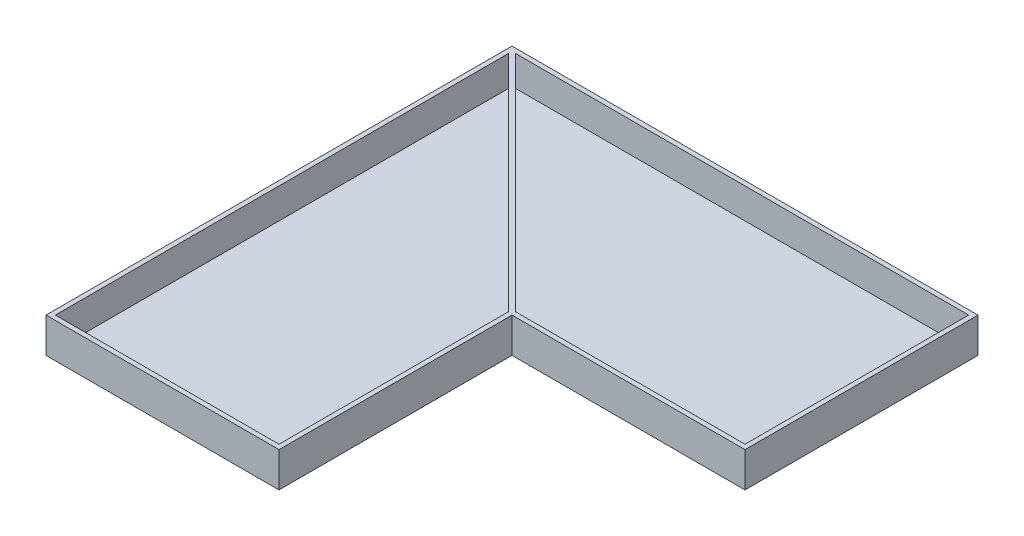
ISO-10303-21;
HEADER;
FILE_DESCRIPTION(('STEP AP214'),'2;1');
FILE_NAME('part.step','',(''),(''),'','','');
FILE_SCHEMA(('AUTOMOTIVE_DESIGN { 1 0 10303 214 1 1 1 1 }'));
ENDSEC;
DATA;
#1=APPLICATION_CONTEXT('core data for automotive mechanical design processes');
#2=APPLICATION_PROTOCOL_DEFINITION('international standard','automotive_design',2000,#1);
#3=PRODUCT_CONTEXT('',#1,'mechanical');
#4=PRODUCT('Part','Part','',(#3));
#5=PRODUCT_RELATED_PRODUCT_CATEGORY('part','',(#4));
#6=PRODUCT_DEFINITION_FORMATION('','',#4);
#7=PRODUCT_DEFINITION_CONTEXT('part definition',#1,'design');
#8=PRODUCT_DEFINITION('design','',#6,#7);
#9=PRODUCT_DEFINITION_SHAPE('','',#8);
#10=(LENGTH_UNIT() NAMED_UNIT(*) SI_UNIT(.MILLI.,.METRE.));
#11=(NAMED_UNIT(*) PLANE_ANGLE_UNIT() SI_UNIT($,.RADIAN.));
#12=(NAMED_UNIT(*) SI_UNIT($,.STERADIAN.) SOLID_ANGLE_UNIT());
#13=UNCERTAINTY_MEASURE_WITH_UNIT(LENGTH_MEASURE(1.E-05),#10,'distance_accuracy_value','');
#14=(GEOMETRIC_REPRESENTATION_CONTEXT(3) GLOBAL_UNCERTAINTY_ASSIGNED_CONTEXT((#13)) GLOBAL_UNIT_ASSIGNED_CONTEXT((#10,
#11,#12)) REPRESENTATION_CONTEXT('',''));
#15=CARTESIAN_POINT('',(0.,0.,0.));
#16=DIRECTION('',(0.,0.,1.));
#17=DIRECTION('',(1.,0.,0.));
#18=AXIS2_PLACEMENT_3D('',#15,#16,#17);
#19=CARTESIAN_POINT('',(0.,20.,0.));
#20=DIRECTION('',(0.,0.,1.));
#21=DIRECTION('',(1.,0.,0.));
#22=AXIS2_PLACEMENT_3D('',#19,#20,#21);
#23=PLANE('',#22);
#24=DIRECTION('',(-1.,0.,0.));
#25=VECTOR('',#24,1.);
#26=CARTESIAN_POINT('',(0.,0.,0.));
#27=LINE('',#26,#25);
#28=CARTESIAN_POINT('',(2000.,0.,0.));
#29=VERTEX_POINT('',#28);
#30=CARTESIAN_POINT('',(0.,0.,0.));
#31=VERTEX_POINT('',#30);
#32=EDGE_CURVE('E264',#29,#31,#27,.T.);
#33=ORIENTED_EDGE('',*,*,#32,.T.);
#34=DIRECTION('',(0.,-1.,0.));
#35=VECTOR('',#34,1.);
#36=CARTESIAN_POINT('',(0.,20.,0.));
#37=LINE('',#36,#35);
#38=CARTESIAN_POINT('',(0.,150.,0.));
#39=VERTEX_POINT('',#38);
#40=EDGE_CURVE('E11',#39,#31,#37,.T.);
#41=ORIENTED_EDGE('',*,*,#40,.F.);
#42=DIRECTION('',(-1.,0.,0.));
#43=VECTOR('',#42,1.);
#44=CARTESIAN_POINT('',(2000.,150.,0.));
#45=LINE('',#44,#43);
#46=CARTESIAN_POINT('',(2000.,150.,0.));
#47=VERTEX_POINT('',#46);
#48=EDGE_CURVE('E260',#47,#39,#45,.T.);
#49=ORIENTED_EDGE('',*,*,#48,.F.);
#50=DIRECTION('',(0.,-1.,0.));
#51=VECTOR('',#50,1.);
#52=CARTESIAN_POINT('',(2000.,20.,0.));
#53=LINE('',#52,#51);
#54=EDGE_CURVE('E283',#47,#29,#53,.T.);
#55=ORIENTED_EDGE('',*,*,#54,.T.);
#56=EDGE_LOOP('',(#33,#41,#49,#55));
#57=FACE_BOUND('',#56,.T.);
#58=ADVANCED_FACE('F45',(#57),#23,.F.);
#59=CARTESIAN_POINT('',(0.,20.,0.));
#60=DIRECTION('',(1.,0.,0.));
#61=DIRECTION('',(0.,0.,-1.));
#62=AXIS2_PLACEMENT_3D('',#59,#60,#61);
#63=PLANE('',#62);
#64=DIRECTION('',(0.,0.,1.));
#65=VECTOR('',#64,1.);
#66=CARTESIAN_POINT('',(0.,0.,0.));
#67=LINE('',#66,#65);
#68=CARTESIAN_POINT('',(2.44929359829471E-13,0.,2000.));
#69=VERTEX_POINT('',#68);
#70=EDGE_CURVE('E268',#31,#69,#67,.T.);
#71=ORIENTED_EDGE('',*,*,#70,.T.);
#72=DIRECTION('',(0.,-1.,0.));
#73=VECTOR('',#72,1.);
#74=CARTESIAN_POINT('',(2.44929359829471E-13,20.,2000.));
#75=LINE('',#74,#73);
#76=CARTESIAN_POINT('',(2.44929359829471E-13,150.,2000.));
#77=VERTEX_POINT('',#76);
#78=EDGE_CURVE('E53',#77,#69,#75,.T.);
#79=ORIENTED_EDGE('',*,*,#78,.F.);
#80=DIRECTION('',(0.,0.,1.));
#81=VECTOR('',#80,1.);
#82=CARTESIAN_POINT('',(0.,150.,0.));
#83=LINE('',#82,#81);
#84=EDGE_CURVE('E240',#39,#77,#83,.T.);
#85=ORIENTED_EDGE('',*,*,#84,.F.);
#86=ORIENTED_EDGE('',*,*,#40,.T.);
#87=EDGE_LOOP('',(#71,#79,#85,#86));
#88=FACE_BOUND('',#87,.T.);
#89=ADVANCED_FACE('F325',(#88),#63,.F.);
#90=CARTESIAN_POINT('',(2.44929359829471E-13,20.,2000.));
#91=DIRECTION('',(0.,0.,-1.));
#92=DIRECTION('',(-1.,0.,0.));
#93=AXIS2_PLACEMENT_3D('',#90,#91,#92);
#94=PLANE('',#93);
#95=DIRECTION('',(1.,0.,0.));
#96=VECTOR('',#95,1.);
#97=CARTESIAN_POINT('',(2.44929359829471E-13,0.,2000.));
#98=LINE('',#97,#96);
#99=CARTESIAN_POINT('',(1000.,0.,2000.));
#100=VERTEX_POINT('',#99);
#101=EDGE_CURVE('E271',#69,#100,#98,.T.);
#102=ORIENTED_EDGE('',*,*,#101,.T.);
#103=DIRECTION('',(0.,-1.,0.));
#104=VECTOR('',#103,1.);
#105=CARTESIAN_POINT('',(1000.,20.,2000.));
#106=LINE('',#105,#104);
#107=CARTESIAN_POINT('',(1000.,150.,2000.));
#108=VERTEX_POINT('',#107);
#109=EDGE_CURVE('E295',#108,#100,#106,.T.);
#110=ORIENTED_EDGE('',*,*,#109,.F.);
#111=DIRECTION('',(1.,0.,0.));
#112=VECTOR('',#111,1.);
#113=CARTESIAN_POINT('',(2.44929359829471E-13,150.,2000.));
#114=LINE('',#113,#112);
#115=EDGE_CURVE('E244',#77,#108,#114,.T.);
#116=ORIENTED_EDGE('',*,*,#115,.F.);
#117=ORIENTED_EDGE('',*,*,#78,.T.);
#118=EDGE_LOOP('',(#102,#110,#116,#117));
#119=FACE_BOUND('',#118,.T.);
#120=ADVANCED_FACE('F303',(#119),#94,.F.);
#121=CARTESIAN_POINT('',(1000.,20.,1000.));
#122=DIRECTION('',(-1.,0.,0.));
#123=DIRECTION('',(0.,0.,1.));
#124=AXIS2_PLACEMENT_3D('',#121,#122,#123);
#125=PLANE('',#124);
#126=DIRECTION('',(0.,0.,-1.));
#127=VECTOR('',#126,1.);
#128=CARTESIAN_POINT('',(1000.,0.,1000.));
#129=LINE('',#128,#127);
#130=CARTESIAN_POINT('',(1000.,0.,1000.));
#131=VERTEX_POINT('',#130);
#132=EDGE_CURVE('E274',#100,#131,#129,.T.);
#133=ORIENTED_EDGE('',*,*,#132,.T.);
#134=DIRECTION('',(0.,-1.,0.));
#135=VECTOR('',#134,1.);
#136=CARTESIAN_POINT('',(1000.,20.,1000.));
#137=LINE('',#136,#135);
#138=CARTESIAN_POINT('',(1000.,150.,1000.));
#139=VERTEX_POINT('',#138);
#140=EDGE_CURVE('E291',#139,#131,#137,.T.);
#141=ORIENTED_EDGE('',*,*,#140,.F.);
#142=DIRECTION('',(0.,0.,-1.));
#143=VECTOR('',#142,1.);
#144=CARTESIAN_POINT('',(1000.,150.,2000.));
#145=LINE('',#144,#143);
#146=EDGE_CURVE('E248',#108,#139,#145,.T.);
#147=ORIENTED_EDGE('',*,*,#146,.F.);
#148=ORIENTED_EDGE('',*,*,#109,.T.);
#149=EDGE_LOOP('',(#133,#141,#147,#148));
#150=FACE_BOUND('',#149,.T.);
#151=ADVANCED_FACE('F313',(#150),#125,.F.);
#152=CARTESIAN_POINT('',(1000.,20.,1000.));
#153=DIRECTION('',(0.,0.,-1.));
#154=DIRECTION('',(-1.,0.,0.));
#155=AXIS2_PLACEMENT_3D('',#152,#153,#154);
#156=PLANE('',#155);
#157=DIRECTION('',(1.,0.,0.));
#158=VECTOR('',#157,1.);
#159=CARTESIAN_POINT('',(1000.,0.,1000.));
#160=LINE('',#159,#158);
#161=CARTESIAN_POINT('',(2000.,0.,1000.));
#162=VERTEX_POINT('',#161);
#163=EDGE_CURVE('E277',#131,#162,#160,.T.);
#164=ORIENTED_EDGE('',*,*,#163,.T.);
#165=DIRECTION('',(0.,-1.,0.));
#166=VECTOR('',#165,1.);
#167=CARTESIAN_POINT('',(2000.,20.,1000.));
#168=LINE('',#167,#166);
#169=CARTESIAN_POINT('',(2000.,150.,1000.));
#170=VERTEX_POINT('',#169);
#171=EDGE_CURVE('E287',#170,#162,#168,.T.);
#172=ORIENTED_EDGE('',*,*,#171,.F.);
#173=DIRECTION('',(1.,0.,0.));
#174=VECTOR('',#173,1.);
#175=CARTESIAN_POINT('',(1000.,150.,1000.));
#176=LINE('',#175,#174);
#177=EDGE_CURVE('E252',#139,#170,#176,.T.);
#178=ORIENTED_EDGE('',*,*,#177,.F.);
#179=ORIENTED_EDGE('',*,*,#140,.T.);
#180=EDGE_LOOP('',(#164,#172,#178,#179));
#181=FACE_BOUND('',#180,.T.);
#182=ADVANCED_FACE('F317',(#181),#156,.F.);
#183=CARTESIAN_POINT('',(2000.,20.,0.));
#184=DIRECTION('',(-1.,0.,0.));
#185=DIRECTION('',(0.,0.,1.));
#186=AXIS2_PLACEMENT_3D('',#183,#184,#185);
#187=PLANE('',#186);
#188=DIRECTION('',(0.,0.,-1.));
#189=VECTOR('',#188,1.);
#190=CARTESIAN_POINT('',(2000.,0.,0.));
#191=LINE('',#190,#189);
#192=EDGE_CURVE('E280',#162,#29,#191,.T.);
#193=ORIENTED_EDGE('',*,*,#192,.T.);
#194=ORIENTED_EDGE('',*,*,#54,.F.);
#195=DIRECTION('',(0.,0.,-1.));
#196=VECTOR('',#195,1.);
#197=CARTESIAN_POINT('',(2000.,150.,1000.));
#198=LINE('',#197,#196);
#199=EDGE_CURVE('E256',#170,#47,#198,.T.);
#200=ORIENTED_EDGE('',*,*,#199,.F.);
#201=ORIENTED_EDGE('',*,*,#171,.T.);
#202=EDGE_LOOP('',(#193,#194,#200,#201));
#203=FACE_BOUND('',#202,.T.);
#204=ADVANCED_FACE('F323',(#203),#187,.F.);
#205=CARTESIAN_POINT('',(0.,0.,0.));
#206=DIRECTION('',(0.,-1.,0.));
#207=DIRECTION('',(0.,0.,-1.));
#208=AXIS2_PLACEMENT_3D('',#205,#206,#207);
#209=PLANE('',#208);
#210=ORIENTED_EDGE('',*,*,#32,.F.);
#211=ORIENTED_EDGE('',*,*,#192,.F.);
#212=ORIENTED_EDGE('',*,*,#163,.F.);
#213=ORIENTED_EDGE('',*,*,#132,.F.);
#214=ORIENTED_EDGE('',*,*,#101,.F.);
#215=ORIENTED_EDGE('',*,*,#70,.F.);
#216=EDGE_LOOP('',(#210,#211,#212,#213,#214,#215));
#217=FACE_BOUND('',#216,.T.);
#218=ADVANCED_FACE('F309',(#217),#209,.T.);
#219=CARTESIAN_POINT('',(0.,150.,0.));
#220=DIRECTION('',(0.,1.,0.));
#221=DIRECTION('',(0.,0.,1.));
#222=AXIS2_PLACEMENT_3D('',#219,#220,#221);
#223=PLANE('',#222);
#224=ORIENTED_EDGE('',*,*,#84,.T.);
#225=ORIENTED_EDGE('',*,*,#115,.T.);
#226=ORIENTED_EDGE('',*,*,#146,.T.);
#227=ORIENTED_EDGE('',*,*,#177,.T.);
#228=ORIENTED_EDGE('',*,*,#199,.T.);
#229=ORIENTED_EDGE('',*,*,#48,.T.);
#230=EDGE_LOOP('',(#224,#225,#226,#227,#228,#229));
#231=FACE_BOUND('',#230,.T.);
#232=DIRECTION('',(0.,0.,-1.));
#233=VECTOR('',#232,1.);
#234=CARTESIAN_POINT('',(980.,150.,1980.));
#235=LINE('',#234,#233);
#236=CARTESIAN_POINT('',(980.,150.,1980.));
#237=VERTEX_POINT('',#236);
#238=CARTESIAN_POINT('',(980.,150.,994.142135623732));
#239=VERTEX_POINT('',#238);
#240=EDGE_CURVE('E203',#237,#239,#235,.T.);
#241=ORIENTED_EDGE('',*,*,#240,.F.);
#242=DIRECTION('',(1.,0.,0.));
#243=VECTOR('',#242,1.);
#244=CARTESIAN_POINT('',(20.,150.,1980.));
#245=LINE('',#244,#243);
#246=CARTESIAN_POINT('',(20.,150.,1980.));
#247=VERTEX_POINT('',#246);
#248=EDGE_CURVE('E200',#247,#237,#245,.T.);
#249=ORIENTED_EDGE('',*,*,#248,.F.);
#250=DIRECTION('',(0.,0.,1.));
#251=VECTOR('',#250,1.);
#252=CARTESIAN_POINT('',(20.,150.,34.142135623731));
#253=LINE('',#252,#251);
#254=CARTESIAN_POINT('',(20.,150.,34.142135623731));
#255=VERTEX_POINT('',#254);
#256=EDGE_CURVE('E211',#255,#247,#253,.T.);
#257=ORIENTED_EDGE('',*,*,#256,.F.);
#258=DIRECTION('',(-0.707106781186547,0.,-0.707106781186548));
#259=VECTOR('',#258,1.);
#260=CARTESIAN_POINT('',(20.,150.,34.142135623731));
#261=LINE('',#260,#259);
#262=EDGE_CURVE('E207',#239,#255,#261,.T.);
#263=ORIENTED_EDGE('',*,*,#262,.F.);
#264=EDGE_LOOP('',(#241,#249,#257,#263));
#265=FACE_BOUND('',#264,.T.);
#266=DIRECTION('',(-1.,0.,0.));
#267=VECTOR('',#266,1.);
#268=CARTESIAN_POINT('',(1980.,150.,20.));
#269=LINE('',#268,#267);
#270=CARTESIAN_POINT('',(1980.,150.,20.));
#271=VERTEX_POINT('',#270);
#272=CARTESIAN_POINT('',(34.1421356237314,150.,20.0000000000001));
#273=VERTEX_POINT('',#272);
#274=EDGE_CURVE('E157',#271,#273,#269,.T.);
#275=ORIENTED_EDGE('',*,*,#274,.F.);
#276=DIRECTION('',(0.,0.,-1.));
#277=VECTOR('',#276,1.);
#278=CARTESIAN_POINT('',(1980.,150.,980.));
#279=LINE('',#278,#277);
#280=CARTESIAN_POINT('',(1980.,150.,980.));
#281=VERTEX_POINT('',#280);
#282=EDGE_CURVE('E148',#281,#271,#279,.T.);
#283=ORIENTED_EDGE('',*,*,#282,.F.);
#284=DIRECTION('',(1.,0.,0.));
#285=VECTOR('',#284,1.);
#286=CARTESIAN_POINT('',(994.142135623731,150.,980.));
#287=LINE('',#286,#285);
#288=CARTESIAN_POINT('',(994.142135623731,150.,980.));
#289=VERTEX_POINT('',#288);
#290=EDGE_CURVE('E176',#289,#281,#287,.T.);
#291=ORIENTED_EDGE('',*,*,#290,.F.);
#292=DIRECTION('',(0.707106781186547,0.,0.707106781186548));
#293=VECTOR('',#292,1.);
#294=CARTESIAN_POINT('',(34.1421356237314,150.,20.0000000000001));
#295=LINE('',#294,#293);
#296=EDGE_CURVE('E172',#273,#289,#295,.T.);
#297=ORIENTED_EDGE('',*,*,#296,.F.);
#298=EDGE_LOOP('',(#275,#283,#291,#297));
#299=FACE_BOUND('',#298,.T.);
#300=ADVANCED_FACE('F170',(#231,#265,#299),#223,.T.);
#301=CARTESIAN_POINT('',(20.,150.,1980.));
#302=DIRECTION('',(0.,0.,-1.));
#303=DIRECTION('',(-1.,0.,0.));
#304=AXIS2_PLACEMENT_3D('',#301,#302,#303);
#305=PLANE('',#304);
#306=DIRECTION('',(1.,0.,0.));
#307=VECTOR('',#306,1.);
#308=CARTESIAN_POINT('',(20.,20.,1980.));
#309=LINE('',#308,#307);
#310=CARTESIAN_POINT('',(20.,20.,1980.));
#311=VERTEX_POINT('',#310);
#312=CARTESIAN_POINT('',(980.,20.,1980.));
#313=VERTEX_POINT('',#312);
#314=EDGE_CURVE('E166',#311,#313,#309,.T.);
#315=ORIENTED_EDGE('',*,*,#314,.F.);
#316=DIRECTION('',(0.,-1.,0.));
#317=VECTOR('',#316,1.);
#318=CARTESIAN_POINT('',(20.,150.,1980.));
#319=LINE('',#318,#317);
#320=EDGE_CURVE('E60',#247,#311,#319,.T.);
#321=ORIENTED_EDGE('',*,*,#320,.F.);
#322=ORIENTED_EDGE('',*,*,#248,.T.);
#323=DIRECTION('',(0.,-1.,0.));
#324=VECTOR('',#323,1.);
#325=CARTESIAN_POINT('',(980.,150.,1980.));
#326=LINE('',#325,#324);
#327=EDGE_CURVE('E236',#237,#313,#326,.T.);
#328=ORIENTED_EDGE('',*,*,#327,.T.);
#329=EDGE_LOOP('',(#315,#321,#322,#328));
#330=FACE_BOUND('',#329,.T.);
#331=ADVANCED_FACE('F348',(#330),#305,.T.);
#332=CARTESIAN_POINT('',(980.,150.,1980.));
#333=DIRECTION('',(-1.,0.,0.));
#334=DIRECTION('',(0.,0.,1.));
#335=AXIS2_PLACEMENT_3D('',#332,#333,#334);
#336=PLANE('',#335);
#337=DIRECTION('',(0.,0.,-1.));
#338=VECTOR('',#337,1.);
#339=CARTESIAN_POINT('',(980.,20.,1980.));
#340=LINE('',#339,#338);
#341=CARTESIAN_POINT('',(980.,20.,994.142135623732));
#342=VERTEX_POINT('',#341);
#343=EDGE_CURVE('E217',#313,#342,#340,.T.);
#344=ORIENTED_EDGE('',*,*,#343,.F.);
#345=ORIENTED_EDGE('',*,*,#327,.F.);
#346=ORIENTED_EDGE('',*,*,#240,.T.);
#347=DIRECTION('',(0.,-1.,0.));
#348=VECTOR('',#347,1.);
#349=CARTESIAN_POINT('',(980.,150.,994.142135623732));
#350=LINE('',#349,#348);
#351=EDGE_CURVE('E233',#239,#342,#350,.T.);
#352=ORIENTED_EDGE('',*,*,#351,.T.);
#353=EDGE_LOOP('',(#344,#345,#346,#352));
#354=FACE_BOUND('',#353,.T.);
#355=ADVANCED_FACE('F351',(#354),#336,.T.);
#356=CARTESIAN_POINT('',(20.,150.,34.142135623731));
#357=DIRECTION('',(-0.707106781186548,0.,0.707106781186547));
#358=DIRECTION('',(0.707106781186547,0.,0.707106781186548));
#359=AXIS2_PLACEMENT_3D('',#356,#357,#358);
#360=PLANE('',#359);
#361=DIRECTION('',(-0.707106781186547,0.,-0.707106781186548));
#362=VECTOR('',#361,1.);
#363=CARTESIAN_POINT('',(20.,20.,34.142135623731));
#364=LINE('',#363,#362);
#365=CARTESIAN_POINT('',(20.,20.,34.142135623731));
#366=VERTEX_POINT('',#365);
#367=EDGE_CURVE('E221',#342,#366,#364,.T.);
#368=ORIENTED_EDGE('',*,*,#367,.F.);
#369=ORIENTED_EDGE('',*,*,#351,.F.);
#370=ORIENTED_EDGE('',*,*,#262,.T.);
#371=DIRECTION('',(0.,-1.,0.));
#372=VECTOR('',#371,1.);
#373=CARTESIAN_POINT('',(20.,150.,34.142135623731));
#374=LINE('',#373,#372);
#375=EDGE_CURVE('E230',#255,#366,#374,.T.);
#376=ORIENTED_EDGE('',*,*,#375,.T.);
#377=EDGE_LOOP('',(#368,#369,#370,#376));
#378=FACE_BOUND('',#377,.T.);
#379=ADVANCED_FACE('F355',(#378),#360,.T.);
#380=CARTESIAN_POINT('',(20.,150.,34.142135623731));
#381=DIRECTION('',(1.,0.,0.));
#382=DIRECTION('',(0.,0.,-1.));
#383=AXIS2_PLACEMENT_3D('',#380,#381,#382);
#384=PLANE('',#383);
#385=DIRECTION('',(0.,0.,1.));
#386=VECTOR('',#385,1.);
#387=CARTESIAN_POINT('',(20.,20.,34.142135623731));
#388=LINE('',#387,#386);
#389=EDGE_CURVE('E204',#366,#311,#388,.T.);
#390=ORIENTED_EDGE('',*,*,#389,.F.);
#391=ORIENTED_EDGE('',*,*,#375,.F.);
#392=ORIENTED_EDGE('',*,*,#256,.T.);
#393=ORIENTED_EDGE('',*,*,#320,.T.);
#394=EDGE_LOOP('',(#390,#391,#392,#393));
#395=FACE_BOUND('',#394,.T.);
#396=ADVANCED_FACE('F359',(#395),#384,.T.);
#397=CARTESIAN_POINT('',(1980.,150.,980.));
#398=DIRECTION('',(-1.,0.,0.));
#399=DIRECTION('',(0.,0.,1.));
#400=AXIS2_PLACEMENT_3D('',#397,#398,#399);
#401=PLANE('',#400);
#402=DIRECTION('',(0.,0.,-1.));
#403=VECTOR('',#402,1.);
#404=CARTESIAN_POINT('',(1980.,20.,980.));
#405=LINE('',#404,#403);
#406=CARTESIAN_POINT('',(1980.,20.,980.));
#407=VERTEX_POINT('',#406);
#408=CARTESIAN_POINT('',(1980.,20.,20.));
#409=VERTEX_POINT('',#408);
#410=EDGE_CURVE('E181',#407,#409,#405,.T.);
#411=ORIENTED_EDGE('',*,*,#410,.F.);
#412=DIRECTION('',(0.,-1.,0.));
#413=VECTOR('',#412,1.);
#414=CARTESIAN_POINT('',(1980.,150.,980.));
#415=LINE('',#414,#413);
#416=EDGE_CURVE('E68',#281,#407,#415,.T.);
#417=ORIENTED_EDGE('',*,*,#416,.F.);
#418=ORIENTED_EDGE('',*,*,#282,.T.);
#419=DIRECTION('',(0.,-1.,0.));
#420=VECTOR('',#419,1.);
#421=CARTESIAN_POINT('',(1980.,150.,20.));
#422=LINE('',#421,#420);
#423=EDGE_CURVE('E151',#271,#409,#422,.T.);
#424=ORIENTED_EDGE('',*,*,#423,.T.);
#425=EDGE_LOOP('',(#411,#417,#418,#424));
#426=FACE_BOUND('',#425,.T.);
#427=ADVANCED_FACE('F150',(#426),#401,.T.);
#428=CARTESIAN_POINT('',(1980.,150.,20.));
#429=DIRECTION('',(0.,0.,1.));
#430=DIRECTION('',(1.,0.,0.));
#431=AXIS2_PLACEMENT_3D('',#428,#429,#430);
#432=PLANE('',#431);
#433=DIRECTION('',(-1.,0.,0.));
#434=VECTOR('',#433,1.);
#435=CARTESIAN_POINT('',(1980.,20.,20.));
#436=LINE('',#435,#434);
#437=CARTESIAN_POINT('',(34.1421356237314,20.,20.0000000000001));
#438=VERTEX_POINT('',#437);
#439=EDGE_CURVE('E164',#409,#438,#436,.T.);
#440=ORIENTED_EDGE('',*,*,#439,.F.);
#441=ORIENTED_EDGE('',*,*,#423,.F.);
#442=ORIENTED_EDGE('',*,*,#274,.T.);
#443=DIRECTION('',(0.,-1.,0.));
#444=VECTOR('',#443,1.);
#445=CARTESIAN_POINT('',(34.1421356237314,150.,20.0000000000001));
#446=LINE('',#445,#444);
#447=EDGE_CURVE('E167',#273,#438,#446,.T.);
#448=ORIENTED_EDGE('',*,*,#447,.T.);
#449=EDGE_LOOP('',(#440,#441,#442,#448));
#450=FACE_BOUND('',#449,.T.);
#451=ADVANCED_FACE('F161',(#450),#432,.T.);
#452=CARTESIAN_POINT('',(34.1421356237314,150.,20.0000000000001));
#453=DIRECTION('',(0.707106781186548,0.,-0.707106781186547));
#454=DIRECTION('',(-0.707106781186547,0.,-0.707106781186548));
#455=AXIS2_PLACEMENT_3D('',#452,#453,#454);
#456=PLANE('',#455);
#457=DIRECTION('',(0.707106781186547,0.,0.707106781186548));
#458=VECTOR('',#457,1.);
#459=CARTESIAN_POINT('',(34.1421356237314,20.,20.0000000000001));
#460=LINE('',#459,#458);
#461=CARTESIAN_POINT('',(994.142135623731,20.,980.));
#462=VERTEX_POINT('',#461);
#463=EDGE_CURVE('E186',#438,#462,#460,.T.);
#464=ORIENTED_EDGE('',*,*,#463,.F.);
#465=ORIENTED_EDGE('',*,*,#447,.F.);
#466=ORIENTED_EDGE('',*,*,#296,.T.);
#467=DIRECTION('',(0.,-1.,0.));
#468=VECTOR('',#467,1.);
#469=CARTESIAN_POINT('',(994.142135623731,150.,980.));
#470=LINE('',#469,#468);
#471=EDGE_CURVE('E195',#289,#462,#470,.T.);
#472=ORIENTED_EDGE('',*,*,#471,.T.);
#473=EDGE_LOOP('',(#464,#465,#466,#472));
#474=FACE_BOUND('',#473,.T.);
#475=ADVANCED_FACE('F367',(#474),#456,.T.);
#476=CARTESIAN_POINT('',(994.142135623731,150.,980.));
#477=DIRECTION('',(0.,0.,-1.));
#478=DIRECTION('',(-1.,0.,0.));
#479=AXIS2_PLACEMENT_3D('',#476,#477,#478);
#480=PLANE('',#479);
#481=DIRECTION('',(1.,0.,0.));
#482=VECTOR('',#481,1.);
#483=CARTESIAN_POINT('',(994.142135623731,20.,980.));
#484=LINE('',#483,#482);
#485=EDGE_CURVE('E158',#462,#407,#484,.T.);
#486=ORIENTED_EDGE('',*,*,#485,.F.);
#487=ORIENTED_EDGE('',*,*,#471,.F.);
#488=ORIENTED_EDGE('',*,*,#290,.T.);
#489=ORIENTED_EDGE('',*,*,#416,.T.);
#490=EDGE_LOOP('',(#486,#487,#488,#489));
#491=FACE_BOUND('',#490,.T.);
#492=ADVANCED_FACE('F370',(#491),#480,.T.);
#493=CARTESIAN_POINT('',(0.,20.,0.));
#494=DIRECTION('',(0.,-1.,0.));
#495=DIRECTION('',(0.,0.,-1.));
#496=AXIS2_PLACEMENT_3D('',#493,#494,#495);
#497=PLANE('',#496);
#498=ORIENTED_EDGE('',*,*,#389,.T.);
#499=ORIENTED_EDGE('',*,*,#314,.T.);
#500=ORIENTED_EDGE('',*,*,#343,.T.);
#501=ORIENTED_EDGE('',*,*,#367,.T.);
#502=EDGE_LOOP('',(#498,#499,#500,#501));
#503=FACE_BOUND('',#502,.T.);
#504=ADVANCED_FACE('F344',(#503),#497,.F.);
#505=ORIENTED_EDGE('',*,*,#485,.T.);
#506=ORIENTED_EDGE('',*,*,#410,.T.);
#507=ORIENTED_EDGE('',*,*,#439,.T.);
#508=ORIENTED_EDGE('',*,*,#463,.T.);
#509=EDGE_LOOP('',(#505,#506,#507,#508));
#510=FACE_BOUND('',#509,.T.);
#511=ADVANCED_FACE('F341',(#510),#497,.F.);
#512=CLOSED_SHELL('',(#58,#89,#120,#151,#182,#204,#218,#300,#331,#355,#379,#396,#427,#451,#475,
#492,#504,#511));
#513=MANIFOLD_SOLID_BREP('B2',#512);
#514=ADVANCED_BREP_SHAPE_REPRESENTATION('',(#18,#513),#14);
#515=SHAPE_DEFINITION_REPRESENTATION(#9,#514);
ENDSEC;
END-ISO-10303-21;
